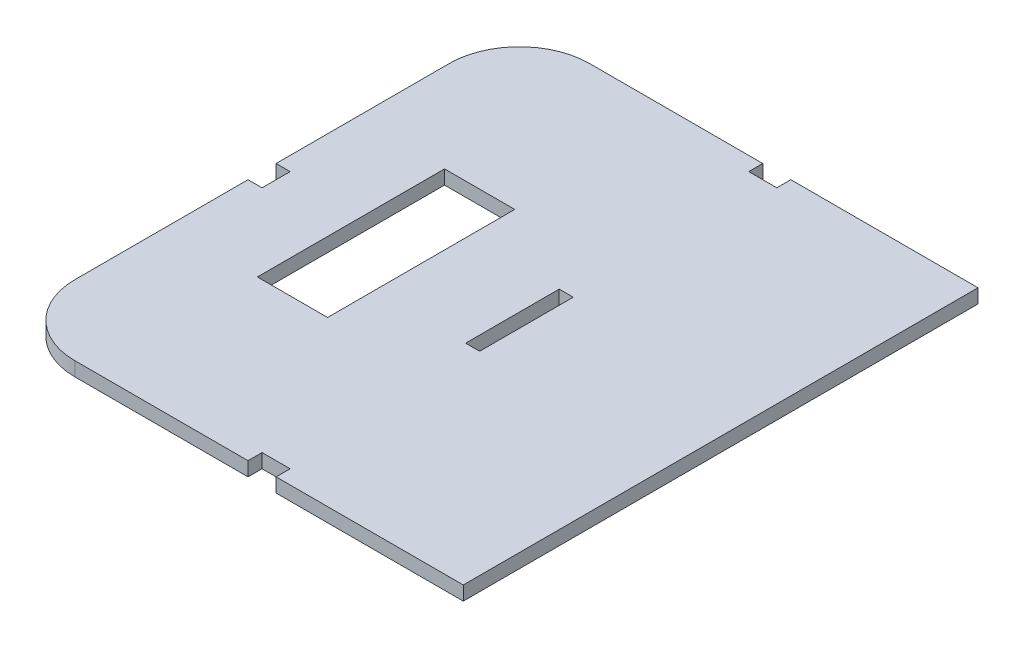
ISO-10303-21;
HEADER;
FILE_DESCRIPTION(('STEP AP214'),'2;1');
FILE_NAME('part.step','',(''),(''),'','','');
FILE_SCHEMA(('AUTOMOTIVE_DESIGN { 1 0 10303 214 1 1 1 1 }'));
ENDSEC;
DATA;
#1=APPLICATION_CONTEXT('core data for automotive mechanical design processes');
#2=APPLICATION_PROTOCOL_DEFINITION('international standard','automotive_design',2000,#1);
#3=PRODUCT_CONTEXT('',#1,'mechanical');
#4=PRODUCT('Part','Part','',(#3));
#5=PRODUCT_RELATED_PRODUCT_CATEGORY('part','',(#4));
#6=PRODUCT_DEFINITION_FORMATION('','',#4);
#7=PRODUCT_DEFINITION_CONTEXT('part definition',#1,'design');
#8=PRODUCT_DEFINITION('design','',#6,#7);
#9=PRODUCT_DEFINITION_SHAPE('','',#8);
#10=(LENGTH_UNIT() NAMED_UNIT(*) SI_UNIT(.MILLI.,.METRE.));
#11=(NAMED_UNIT(*) PLANE_ANGLE_UNIT() SI_UNIT($,.RADIAN.));
#12=(NAMED_UNIT(*) SI_UNIT($,.STERADIAN.) SOLID_ANGLE_UNIT());
#13=UNCERTAINTY_MEASURE_WITH_UNIT(LENGTH_MEASURE(1.E-05),#10,'distance_accuracy_value','');
#14=(GEOMETRIC_REPRESENTATION_CONTEXT(3) GLOBAL_UNCERTAINTY_ASSIGNED_CONTEXT((#13)) GLOBAL_UNIT_ASSIGNED_CONTEXT((#10,
#11,#12)) REPRESENTATION_CONTEXT('',''));
#15=CARTESIAN_POINT('',(0.,0.,0.));
#16=DIRECTION('',(0.,0.,1.));
#17=DIRECTION('',(1.,0.,0.));
#18=AXIS2_PLACEMENT_3D('',#15,#16,#17);
#19=CARTESIAN_POINT('',(0.,3.,-110.));
#20=DIRECTION('',(0.,0.,-1.));
#21=DIRECTION('',(-1.,0.,0.));
#22=AXIS2_PLACEMENT_3D('',#19,#20,#21);
#23=PLANE('',#22);
#24=DIRECTION('',(1.,0.,0.));
#25=VECTOR('',#24,1.);
#26=CARTESIAN_POINT('',(0.,0.,-110.));
#27=LINE('',#26,#25);
#28=CARTESIAN_POINT('',(58.,0.,-110.));
#29=VERTEX_POINT('',#28);
#30=CARTESIAN_POINT('',(98.,0.,-110.));
#31=VERTEX_POINT('',#30);
#32=EDGE_CURVE('E247',#29,#31,#27,.T.);
#33=ORIENTED_EDGE('',*,*,#32,.F.);
#34=DIRECTION('',(0.,-1.,0.));
#35=VECTOR('',#34,1.);
#36=CARTESIAN_POINT('',(58.,3.,-110.));
#37=LINE('',#36,#35);
#38=CARTESIAN_POINT('',(58.,3.,-110.));
#39=VERTEX_POINT('',#38);
#40=EDGE_CURVE('E385',#39,#29,#37,.T.);
#41=ORIENTED_EDGE('',*,*,#40,.F.);
#42=DIRECTION('',(1.,0.,0.));
#43=VECTOR('',#42,1.);
#44=CARTESIAN_POINT('',(0.,3.,-110.));
#45=LINE('',#44,#43);
#46=CARTESIAN_POINT('',(98.,3.,-110.));
#47=VERTEX_POINT('',#46);
#48=EDGE_CURVE('E270',#39,#47,#45,.T.);
#49=ORIENTED_EDGE('',*,*,#48,.T.);
#50=DIRECTION('',(0.,-1.,0.));
#51=VECTOR('',#50,1.);
#52=CARTESIAN_POINT('',(98.,3.,-110.));
#53=LINE('',#52,#51);
#54=EDGE_CURVE('E313',#47,#31,#53,.T.);
#55=ORIENTED_EDGE('',*,*,#54,.T.);
#56=EDGE_LOOP('',(#33,#41,#49,#55));
#57=FACE_BOUND('',#56,.T.);
#58=ADVANCED_FACE('F41',(#57),#23,.T.);
#59=CARTESIAN_POINT('',(58.,3.,0.));
#60=DIRECTION('',(-1.,0.,0.));
#61=DIRECTION('',(0.,0.,1.));
#62=AXIS2_PLACEMENT_3D('',#59,#60,#61);
#63=PLANE('',#62);
#64=DIRECTION('',(0.,0.,-1.));
#65=VECTOR('',#64,1.);
#66=CARTESIAN_POINT('',(58.,0.,0.));
#67=LINE('',#66,#65);
#68=CARTESIAN_POINT('',(58.,0.,-107.));
#69=VERTEX_POINT('',#68);
#70=EDGE_CURVE('E316',#69,#29,#67,.T.);
#71=ORIENTED_EDGE('',*,*,#70,.F.);
#72=DIRECTION('',(0.,-1.,0.));
#73=VECTOR('',#72,1.);
#74=CARTESIAN_POINT('',(58.,3.,-107.));
#75=LINE('',#74,#73);
#76=CARTESIAN_POINT('',(58.,3.,-107.));
#77=VERTEX_POINT('',#76);
#78=EDGE_CURVE('E383',#77,#69,#75,.T.);
#79=ORIENTED_EDGE('',*,*,#78,.F.);
#80=DIRECTION('',(0.,0.,-1.));
#81=VECTOR('',#80,1.);
#82=CARTESIAN_POINT('',(58.,3.,0.));
#83=LINE('',#82,#81);
#84=EDGE_CURVE('E273',#77,#39,#83,.T.);
#85=ORIENTED_EDGE('',*,*,#84,.T.);
#86=ORIENTED_EDGE('',*,*,#40,.T.);
#87=EDGE_LOOP('',(#71,#79,#85,#86));
#88=FACE_BOUND('',#87,.T.);
#89=ADVANCED_FACE('F482',(#88),#63,.T.);
#90=CARTESIAN_POINT('',(0.,3.,-107.));
#91=DIRECTION('',(0.,0.,-1.));
#92=DIRECTION('',(-1.,0.,0.));
#93=AXIS2_PLACEMENT_3D('',#90,#91,#92);
#94=PLANE('',#93);
#95=DIRECTION('',(1.,0.,0.));
#96=VECTOR('',#95,1.);
#97=CARTESIAN_POINT('',(0.,0.,-107.));
#98=LINE('',#97,#96);
#99=CARTESIAN_POINT('',(52.,0.,-107.));
#100=VERTEX_POINT('',#99);
#101=EDGE_CURVE('E319',#100,#69,#98,.T.);
#102=ORIENTED_EDGE('',*,*,#101,.F.);
#103=DIRECTION('',(0.,-1.,0.));
#104=VECTOR('',#103,1.);
#105=CARTESIAN_POINT('',(52.,3.,-107.));
#106=LINE('',#105,#104);
#107=CARTESIAN_POINT('',(52.,3.,-107.));
#108=VERTEX_POINT('',#107);
#109=EDGE_CURVE('E381',#108,#100,#106,.T.);
#110=ORIENTED_EDGE('',*,*,#109,.F.);
#111=DIRECTION('',(1.,0.,0.));
#112=VECTOR('',#111,1.);
#113=CARTESIAN_POINT('',(0.,3.,-107.));
#114=LINE('',#113,#112);
#115=EDGE_CURVE('E277',#108,#77,#114,.T.);
#116=ORIENTED_EDGE('',*,*,#115,.T.);
#117=ORIENTED_EDGE('',*,*,#78,.T.);
#118=EDGE_LOOP('',(#102,#110,#116,#117));
#119=FACE_BOUND('',#118,.T.);
#120=ADVANCED_FACE('F485',(#119),#94,.T.);
#121=CARTESIAN_POINT('',(52.,3.,0.));
#122=DIRECTION('',(-1.,0.,0.));
#123=DIRECTION('',(0.,0.,1.));
#124=AXIS2_PLACEMENT_3D('',#121,#122,#123);
#125=PLANE('',#124);
#126=DIRECTION('',(0.,0.,-1.));
#127=VECTOR('',#126,1.);
#128=CARTESIAN_POINT('',(52.,0.,0.));
#129=LINE('',#128,#127);
#130=CARTESIAN_POINT('',(52.,0.,-110.));
#131=VERTEX_POINT('',#130);
#132=EDGE_CURVE('E322',#100,#131,#129,.T.);
#133=ORIENTED_EDGE('',*,*,#132,.T.);
#134=DIRECTION('',(0.,-1.,0.));
#135=VECTOR('',#134,1.);
#136=CARTESIAN_POINT('',(52.,3.,-110.));
#137=LINE('',#136,#135);
#138=CARTESIAN_POINT('',(52.,3.,-110.));
#139=VERTEX_POINT('',#138);
#140=EDGE_CURVE('E378',#139,#131,#137,.T.);
#141=ORIENTED_EDGE('',*,*,#140,.F.);
#142=DIRECTION('',(0.,0.,-1.));
#143=VECTOR('',#142,1.);
#144=CARTESIAN_POINT('',(52.,3.,0.));
#145=LINE('',#144,#143);
#146=EDGE_CURVE('E280',#108,#139,#145,.T.);
#147=ORIENTED_EDGE('',*,*,#146,.F.);
#148=ORIENTED_EDGE('',*,*,#109,.T.);
#149=EDGE_LOOP('',(#133,#141,#147,#148));
#150=FACE_BOUND('',#149,.T.);
#151=ADVANCED_FACE('F489',(#150),#125,.F.);
#152=CARTESIAN_POINT('',(0.,3.,-110.));
#153=DIRECTION('',(0.,0.,-1.));
#154=DIRECTION('',(-1.,0.,0.));
#155=AXIS2_PLACEMENT_3D('',#152,#153,#154);
#156=PLANE('',#155);
#157=DIRECTION('',(1.,0.,0.));
#158=VECTOR('',#157,1.);
#159=CARTESIAN_POINT('',(0.,0.,-110.));
#160=LINE('',#159,#158);
#161=CARTESIAN_POINT('',(15.,0.,-110.));
#162=VERTEX_POINT('',#161);
#163=EDGE_CURVE('E325',#162,#131,#160,.T.);
#164=ORIENTED_EDGE('',*,*,#163,.F.);
#165=DIRECTION('',(0.,-1.,0.));
#166=VECTOR('',#165,1.);
#167=CARTESIAN_POINT('',(15.,3.,-110.));
#168=LINE('',#167,#166);
#169=CARTESIAN_POINT('',(15.,3.,-110.));
#170=VERTEX_POINT('',#169);
#171=EDGE_CURVE('E11',#162,#170,#168,.F.);
#172=ORIENTED_EDGE('',*,*,#171,.T.);
#173=DIRECTION('',(1.,0.,0.));
#174=VECTOR('',#173,1.);
#175=CARTESIAN_POINT('',(0.,3.,-110.));
#176=LINE('',#175,#174);
#177=EDGE_CURVE('E283',#170,#139,#176,.T.);
#178=ORIENTED_EDGE('',*,*,#177,.T.);
#179=ORIENTED_EDGE('',*,*,#140,.T.);
#180=EDGE_LOOP('',(#164,#172,#178,#179));
#181=FACE_BOUND('',#180,.T.);
#182=ADVANCED_FACE('F491',(#181),#156,.T.);
#183=CARTESIAN_POINT('',(0.,3.,0.));
#184=DIRECTION('',(-1.,0.,0.));
#185=DIRECTION('',(0.,0.,1.));
#186=AXIS2_PLACEMENT_3D('',#183,#184,#185);
#187=PLANE('',#186);
#188=DIRECTION('',(0.,0.,-1.));
#189=VECTOR('',#188,1.);
#190=CARTESIAN_POINT('',(0.,3.,0.));
#191=LINE('',#190,#189);
#192=CARTESIAN_POINT('',(0.,3.,-58.));
#193=VERTEX_POINT('',#192);
#194=CARTESIAN_POINT('',(0.,3.,-95.));
#195=VERTEX_POINT('',#194);
#196=EDGE_CURVE('E285',#193,#195,#191,.T.);
#197=ORIENTED_EDGE('',*,*,#196,.T.);
#198=DIRECTION('',(0.,-1.,0.));
#199=VECTOR('',#198,1.);
#200=CARTESIAN_POINT('',(0.,3.,-95.));
#201=LINE('',#200,#199);
#202=CARTESIAN_POINT('',(0.,0.,-95.));
#203=VERTEX_POINT('',#202);
#204=EDGE_CURVE('E49',#195,#203,#201,.T.);
#205=ORIENTED_EDGE('',*,*,#204,.T.);
#206=DIRECTION('',(0.,0.,-1.));
#207=VECTOR('',#206,1.);
#208=CARTESIAN_POINT('',(0.,0.,0.));
#209=LINE('',#208,#207);
#210=CARTESIAN_POINT('',(0.,0.,-58.));
#211=VERTEX_POINT('',#210);
#212=EDGE_CURVE('E327',#211,#203,#209,.T.);
#213=ORIENTED_EDGE('',*,*,#212,.F.);
#214=DIRECTION('',(0.,-1.,0.));
#215=VECTOR('',#214,1.);
#216=CARTESIAN_POINT('',(0.,3.,-58.));
#217=LINE('',#216,#215);
#218=EDGE_CURVE('E376',#193,#211,#217,.T.);
#219=ORIENTED_EDGE('',*,*,#218,.F.);
#220=EDGE_LOOP('',(#197,#205,#213,#219));
#221=FACE_BOUND('',#220,.T.);
#222=ADVANCED_FACE('F423',(#221),#187,.T.);
#223=CARTESIAN_POINT('',(0.,3.,-58.));
#224=DIRECTION('',(0.,0.,1.));
#225=DIRECTION('',(1.,0.,0.));
#226=AXIS2_PLACEMENT_3D('',#223,#224,#225);
#227=PLANE('',#226);
#228=DIRECTION('',(-1.,0.,0.));
#229=VECTOR('',#228,1.);
#230=CARTESIAN_POINT('',(0.,0.,-58.));
#231=LINE('',#230,#229);
#232=CARTESIAN_POINT('',(3.,0.,-58.));
#233=VERTEX_POINT('',#232);
#234=EDGE_CURVE('E330',#233,#211,#231,.T.);
#235=ORIENTED_EDGE('',*,*,#234,.F.);
#236=DIRECTION('',(0.,-1.,0.));
#237=VECTOR('',#236,1.);
#238=CARTESIAN_POINT('',(3.,3.,-58.));
#239=LINE('',#238,#237);
#240=CARTESIAN_POINT('',(3.,3.,-58.));
#241=VERTEX_POINT('',#240);
#242=EDGE_CURVE('E374',#241,#233,#239,.T.);
#243=ORIENTED_EDGE('',*,*,#242,.F.);
#244=DIRECTION('',(-1.,0.,0.));
#245=VECTOR('',#244,1.);
#246=CARTESIAN_POINT('',(0.,3.,-58.));
#247=LINE('',#246,#245);
#248=EDGE_CURVE('E287',#241,#193,#247,.T.);
#249=ORIENTED_EDGE('',*,*,#248,.T.);
#250=ORIENTED_EDGE('',*,*,#218,.T.);
#251=EDGE_LOOP('',(#235,#243,#249,#250));
#252=FACE_BOUND('',#251,.T.);
#253=ADVANCED_FACE('F432',(#252),#227,.T.);
#254=CARTESIAN_POINT('',(3.,3.,0.));
#255=DIRECTION('',(-1.,0.,0.));
#256=DIRECTION('',(0.,0.,1.));
#257=AXIS2_PLACEMENT_3D('',#254,#255,#256);
#258=PLANE('',#257);
#259=DIRECTION('',(0.,0.,-1.));
#260=VECTOR('',#259,1.);
#261=CARTESIAN_POINT('',(3.,0.,0.));
#262=LINE('',#261,#260);
#263=CARTESIAN_POINT('',(3.,0.,-52.));
#264=VERTEX_POINT('',#263);
#265=EDGE_CURVE('E333',#264,#233,#262,.T.);
#266=ORIENTED_EDGE('',*,*,#265,.F.);
#267=DIRECTION('',(0.,-1.,0.));
#268=VECTOR('',#267,1.);
#269=CARTESIAN_POINT('',(3.,3.,-52.));
#270=LINE('',#269,#268);
#271=CARTESIAN_POINT('',(3.,3.,-52.));
#272=VERTEX_POINT('',#271);
#273=EDGE_CURVE('E372',#272,#264,#270,.T.);
#274=ORIENTED_EDGE('',*,*,#273,.F.);
#275=DIRECTION('',(0.,0.,-1.));
#276=VECTOR('',#275,1.);
#277=CARTESIAN_POINT('',(3.,3.,0.));
#278=LINE('',#277,#276);
#279=EDGE_CURVE('E290',#272,#241,#278,.T.);
#280=ORIENTED_EDGE('',*,*,#279,.T.);
#281=ORIENTED_EDGE('',*,*,#242,.T.);
#282=EDGE_LOOP('',(#266,#274,#280,#281));
#283=FACE_BOUND('',#282,.T.);
#284=ADVANCED_FACE('F437',(#283),#258,.T.);
#285=CARTESIAN_POINT('',(0.,3.,-52.));
#286=DIRECTION('',(0.,0.,1.));
#287=DIRECTION('',(1.,0.,0.));
#288=AXIS2_PLACEMENT_3D('',#285,#286,#287);
#289=PLANE('',#288);
#290=DIRECTION('',(-1.,0.,0.));
#291=VECTOR('',#290,1.);
#292=CARTESIAN_POINT('',(0.,0.,-52.));
#293=LINE('',#292,#291);
#294=CARTESIAN_POINT('',(0.,0.,-52.));
#295=VERTEX_POINT('',#294);
#296=EDGE_CURVE('E336',#264,#295,#293,.T.);
#297=ORIENTED_EDGE('',*,*,#296,.T.);
#298=DIRECTION('',(0.,-1.,0.));
#299=VECTOR('',#298,1.);
#300=CARTESIAN_POINT('',(0.,3.,-52.));
#301=LINE('',#300,#299);
#302=CARTESIAN_POINT('',(0.,3.,-52.));
#303=VERTEX_POINT('',#302);
#304=EDGE_CURVE('E369',#303,#295,#301,.T.);
#305=ORIENTED_EDGE('',*,*,#304,.F.);
#306=DIRECTION('',(-1.,0.,0.));
#307=VECTOR('',#306,1.);
#308=CARTESIAN_POINT('',(0.,3.,-52.));
#309=LINE('',#308,#307);
#310=EDGE_CURVE('E293',#272,#303,#309,.T.);
#311=ORIENTED_EDGE('',*,*,#310,.F.);
#312=ORIENTED_EDGE('',*,*,#273,.T.);
#313=EDGE_LOOP('',(#297,#305,#311,#312));
#314=FACE_BOUND('',#313,.T.);
#315=ADVANCED_FACE('F441',(#314),#289,.F.);
#316=CARTESIAN_POINT('',(0.,3.,0.));
#317=DIRECTION('',(-1.,0.,0.));
#318=DIRECTION('',(0.,0.,1.));
#319=AXIS2_PLACEMENT_3D('',#316,#317,#318);
#320=PLANE('',#319);
#321=DIRECTION('',(0.,0.,-1.));
#322=VECTOR('',#321,1.);
#323=CARTESIAN_POINT('',(0.,0.,0.));
#324=LINE('',#323,#322);
#325=CARTESIAN_POINT('',(0.,0.,-15.));
#326=VERTEX_POINT('',#325);
#327=EDGE_CURVE('E339',#326,#295,#324,.T.);
#328=ORIENTED_EDGE('',*,*,#327,.F.);
#329=DIRECTION('',(0.,-1.,0.));
#330=VECTOR('',#329,1.);
#331=CARTESIAN_POINT('',(0.,3.,-15.));
#332=LINE('',#331,#330);
#333=CARTESIAN_POINT('',(0.,3.,-15.));
#334=VERTEX_POINT('',#333);
#335=EDGE_CURVE('E415',#326,#334,#332,.F.);
#336=ORIENTED_EDGE('',*,*,#335,.T.);
#337=DIRECTION('',(0.,0.,-1.));
#338=VECTOR('',#337,1.);
#339=CARTESIAN_POINT('',(0.,3.,0.));
#340=LINE('',#339,#338);
#341=EDGE_CURVE('E296',#334,#303,#340,.T.);
#342=ORIENTED_EDGE('',*,*,#341,.T.);
#343=ORIENTED_EDGE('',*,*,#304,.T.);
#344=EDGE_LOOP('',(#328,#336,#342,#343));
#345=FACE_BOUND('',#344,.T.);
#346=ADVANCED_FACE('F517',(#345),#320,.T.);
#347=CARTESIAN_POINT('',(0.,3.,0.));
#348=DIRECTION('',(0.,0.,-1.));
#349=DIRECTION('',(-1.,0.,0.));
#350=AXIS2_PLACEMENT_3D('',#347,#348,#349);
#351=PLANE('',#350);
#352=DIRECTION('',(1.,0.,0.));
#353=VECTOR('',#352,1.);
#354=CARTESIAN_POINT('',(0.,3.,0.));
#355=LINE('',#354,#353);
#356=CARTESIAN_POINT('',(15.,3.,0.));
#357=VERTEX_POINT('',#356);
#358=CARTESIAN_POINT('',(52.,3.,0.));
#359=VERTEX_POINT('',#358);
#360=EDGE_CURVE('E298',#357,#359,#355,.T.);
#361=ORIENTED_EDGE('',*,*,#360,.F.);
#362=DIRECTION('',(0.,-1.,0.));
#363=VECTOR('',#362,1.);
#364=CARTESIAN_POINT('',(15.,0.,0.));
#365=LINE('',#364,#363);
#366=CARTESIAN_POINT('',(15.,0.,0.));
#367=VERTEX_POINT('',#366);
#368=EDGE_CURVE('E408',#357,#367,#365,.T.);
#369=ORIENTED_EDGE('',*,*,#368,.T.);
#370=DIRECTION('',(1.,0.,0.));
#371=VECTOR('',#370,1.);
#372=CARTESIAN_POINT('',(0.,0.,0.));
#373=LINE('',#372,#371);
#374=CARTESIAN_POINT('',(52.,0.,0.));
#375=VERTEX_POINT('',#374);
#376=EDGE_CURVE('E341',#367,#375,#373,.T.);
#377=ORIENTED_EDGE('',*,*,#376,.T.);
#378=DIRECTION('',(0.,-1.,0.));
#379=VECTOR('',#378,1.);
#380=CARTESIAN_POINT('',(52.,3.,0.));
#381=LINE('',#380,#379);
#382=EDGE_CURVE('E366',#359,#375,#381,.T.);
#383=ORIENTED_EDGE('',*,*,#382,.F.);
#384=EDGE_LOOP('',(#361,#369,#377,#383));
#385=FACE_BOUND('',#384,.T.);
#386=ADVANCED_FACE('F450',(#385),#351,.F.);
#387=CARTESIAN_POINT('',(52.,3.,0.));
#388=DIRECTION('',(1.,0.,0.));
#389=DIRECTION('',(0.,0.,-1.));
#390=AXIS2_PLACEMENT_3D('',#387,#388,#389);
#391=PLANE('',#390);
#392=DIRECTION('',(0.,0.,1.));
#393=VECTOR('',#392,1.);
#394=CARTESIAN_POINT('',(52.,0.,0.));
#395=LINE('',#394,#393);
#396=CARTESIAN_POINT('',(52.,0.,-3.));
#397=VERTEX_POINT('',#396);
#398=EDGE_CURVE('E343',#397,#375,#395,.T.);
#399=ORIENTED_EDGE('',*,*,#398,.F.);
#400=DIRECTION('',(0.,-1.,0.));
#401=VECTOR('',#400,1.);
#402=CARTESIAN_POINT('',(52.,3.,-3.));
#403=LINE('',#402,#401);
#404=CARTESIAN_POINT('',(52.,3.,-3.));
#405=VERTEX_POINT('',#404);
#406=EDGE_CURVE('E364',#405,#397,#403,.T.);
#407=ORIENTED_EDGE('',*,*,#406,.F.);
#408=DIRECTION('',(0.,0.,1.));
#409=VECTOR('',#408,1.);
#410=CARTESIAN_POINT('',(52.,3.,0.));
#411=LINE('',#410,#409);
#412=EDGE_CURVE('E300',#405,#359,#411,.T.);
#413=ORIENTED_EDGE('',*,*,#412,.T.);
#414=ORIENTED_EDGE('',*,*,#382,.T.);
#415=EDGE_LOOP('',(#399,#407,#413,#414));
#416=FACE_BOUND('',#415,.T.);
#417=ADVANCED_FACE('F457',(#416),#391,.T.);
#418=CARTESIAN_POINT('',(0.,3.,-3.));
#419=DIRECTION('',(0.,0.,1.));
#420=DIRECTION('',(1.,0.,0.));
#421=AXIS2_PLACEMENT_3D('',#418,#419,#420);
#422=PLANE('',#421);
#423=DIRECTION('',(-1.,0.,0.));
#424=VECTOR('',#423,1.);
#425=CARTESIAN_POINT('',(0.,0.,-3.));
#426=LINE('',#425,#424);
#427=CARTESIAN_POINT('',(58.,0.,-3.));
#428=VERTEX_POINT('',#427);
#429=EDGE_CURVE('E346',#428,#397,#426,.T.);
#430=ORIENTED_EDGE('',*,*,#429,.F.);
#431=DIRECTION('',(0.,-1.,0.));
#432=VECTOR('',#431,1.);
#433=CARTESIAN_POINT('',(58.,3.,-3.));
#434=LINE('',#433,#432);
#435=CARTESIAN_POINT('',(58.,3.,-3.));
#436=VERTEX_POINT('',#435);
#437=EDGE_CURVE('E362',#436,#428,#434,.T.);
#438=ORIENTED_EDGE('',*,*,#437,.F.);
#439=DIRECTION('',(-1.,0.,0.));
#440=VECTOR('',#439,1.);
#441=CARTESIAN_POINT('',(0.,3.,-3.));
#442=LINE('',#441,#440);
#443=EDGE_CURVE('E303',#436,#405,#442,.T.);
#444=ORIENTED_EDGE('',*,*,#443,.T.);
#445=ORIENTED_EDGE('',*,*,#406,.T.);
#446=EDGE_LOOP('',(#430,#438,#444,#445));
#447=FACE_BOUND('',#446,.T.);
#448=ADVANCED_FACE('F461',(#447),#422,.T.);
#449=CARTESIAN_POINT('',(58.,3.,0.));
#450=DIRECTION('',(1.,0.,0.));
#451=DIRECTION('',(0.,0.,-1.));
#452=AXIS2_PLACEMENT_3D('',#449,#450,#451);
#453=PLANE('',#452);
#454=DIRECTION('',(0.,0.,1.));
#455=VECTOR('',#454,1.);
#456=CARTESIAN_POINT('',(58.,0.,0.));
#457=LINE('',#456,#455);
#458=CARTESIAN_POINT('',(58.,0.,0.));
#459=VERTEX_POINT('',#458);
#460=EDGE_CURVE('E349',#428,#459,#457,.T.);
#461=ORIENTED_EDGE('',*,*,#460,.T.);
#462=DIRECTION('',(0.,-1.,0.));
#463=VECTOR('',#462,1.);
#464=CARTESIAN_POINT('',(58.,3.,0.));
#465=LINE('',#464,#463);
#466=CARTESIAN_POINT('',(58.,3.,0.));
#467=VERTEX_POINT('',#466);
#468=EDGE_CURVE('E359',#467,#459,#465,.T.);
#469=ORIENTED_EDGE('',*,*,#468,.F.);
#470=DIRECTION('',(0.,0.,1.));
#471=VECTOR('',#470,1.);
#472=CARTESIAN_POINT('',(58.,3.,0.));
#473=LINE('',#472,#471);
#474=EDGE_CURVE('E306',#436,#467,#473,.T.);
#475=ORIENTED_EDGE('',*,*,#474,.F.);
#476=ORIENTED_EDGE('',*,*,#437,.T.);
#477=EDGE_LOOP('',(#461,#469,#475,#476));
#478=FACE_BOUND('',#477,.T.);
#479=ADVANCED_FACE('F465',(#478),#453,.F.);
#480=CARTESIAN_POINT('',(0.,3.,0.));
#481=DIRECTION('',(0.,0.,-1.));
#482=DIRECTION('',(-1.,0.,0.));
#483=AXIS2_PLACEMENT_3D('',#480,#481,#482);
#484=PLANE('',#483);
#485=DIRECTION('',(1.,0.,0.));
#486=VECTOR('',#485,1.);
#487=CARTESIAN_POINT('',(0.,0.,0.));
#488=LINE('',#487,#486);
#489=CARTESIAN_POINT('',(98.,0.,0.));
#490=VERTEX_POINT('',#489);
#491=EDGE_CURVE('E351',#459,#490,#488,.T.);
#492=ORIENTED_EDGE('',*,*,#491,.T.);
#493=DIRECTION('',(0.,-1.,0.));
#494=VECTOR('',#493,1.);
#495=CARTESIAN_POINT('',(98.,3.,0.));
#496=LINE('',#495,#494);
#497=CARTESIAN_POINT('',(98.,3.,0.));
#498=VERTEX_POINT('',#497);
#499=EDGE_CURVE('E357',#498,#490,#496,.T.);
#500=ORIENTED_EDGE('',*,*,#499,.F.);
#501=DIRECTION('',(1.,0.,0.));
#502=VECTOR('',#501,1.);
#503=CARTESIAN_POINT('',(0.,3.,0.));
#504=LINE('',#503,#502);
#505=EDGE_CURVE('E308',#467,#498,#504,.T.);
#506=ORIENTED_EDGE('',*,*,#505,.F.);
#507=ORIENTED_EDGE('',*,*,#468,.T.);
#508=EDGE_LOOP('',(#492,#500,#506,#507));
#509=FACE_BOUND('',#508,.T.);
#510=ADVANCED_FACE('F471',(#509),#484,.F.);
#511=CARTESIAN_POINT('',(98.,3.,0.));
#512=DIRECTION('',(1.,0.,0.));
#513=DIRECTION('',(0.,0.,-1.));
#514=AXIS2_PLACEMENT_3D('',#511,#512,#513);
#515=PLANE('',#514);
#516=DIRECTION('',(0.,0.,1.));
#517=VECTOR('',#516,1.);
#518=CARTESIAN_POINT('',(98.,0.,0.));
#519=LINE('',#518,#517);
#520=EDGE_CURVE('E274',#31,#490,#519,.T.);
#521=ORIENTED_EDGE('',*,*,#520,.F.);
#522=ORIENTED_EDGE('',*,*,#54,.F.);
#523=DIRECTION('',(0.,0.,1.));
#524=VECTOR('',#523,1.);
#525=CARTESIAN_POINT('',(98.,3.,0.));
#526=LINE('',#525,#524);
#527=EDGE_CURVE('E310',#47,#498,#526,.T.);
#528=ORIENTED_EDGE('',*,*,#527,.T.);
#529=ORIENTED_EDGE('',*,*,#499,.T.);
#530=EDGE_LOOP('',(#521,#522,#528,#529));
#531=FACE_BOUND('',#530,.T.);
#532=ADVANCED_FACE('F475',(#531),#515,.T.);
#533=CARTESIAN_POINT('',(0.,3.,0.));
#534=DIRECTION('',(0.,1.,0.));
#535=DIRECTION('',(0.,0.,1.));
#536=AXIS2_PLACEMENT_3D('',#533,#534,#535);
#537=PLANE('',#536);
#538=DIRECTION('',(0.,0.,1.));
#539=VECTOR('',#538,1.);
#540=CARTESIAN_POINT('',(19.,3.,-75.));
#541=LINE('',#540,#539);
#542=CARTESIAN_POINT('',(19.,3.,-75.));
#543=VERTEX_POINT('',#542);
#544=CARTESIAN_POINT('',(19.,3.,-35.));
#545=VERTEX_POINT('',#544);
#546=EDGE_CURVE('E235',#543,#545,#541,.T.);
#547=ORIENTED_EDGE('',*,*,#546,.F.);
#548=DIRECTION('',(-1.,0.,0.));
#549=VECTOR('',#548,1.);
#550=CARTESIAN_POINT('',(19.,3.,-75.));
#551=LINE('',#550,#549);
#552=CARTESIAN_POINT('',(34.,3.,-75.0000000000001));
#553=VERTEX_POINT('',#552);
#554=EDGE_CURVE('E240',#553,#543,#551,.T.);
#555=ORIENTED_EDGE('',*,*,#554,.F.);
#556=DIRECTION('',(0.,0.,-1.));
#557=VECTOR('',#556,1.);
#558=CARTESIAN_POINT('',(34.,3.,-75.0000000000001));
#559=LINE('',#558,#557);
#560=CARTESIAN_POINT('',(34.,3.,-35.));
#561=VERTEX_POINT('',#560);
#562=EDGE_CURVE('E219',#561,#553,#559,.T.);
#563=ORIENTED_EDGE('',*,*,#562,.F.);
#564=DIRECTION('',(1.,0.,0.));
#565=VECTOR('',#564,1.);
#566=CARTESIAN_POINT('',(19.,3.,-35.));
#567=LINE('',#566,#565);
#568=EDGE_CURVE('E230',#545,#561,#567,.T.);
#569=ORIENTED_EDGE('',*,*,#568,.F.);
#570=EDGE_LOOP('',(#547,#555,#563,#569));
#571=FACE_BOUND('',#570,.T.);
#572=DIRECTION('',(0.,0.,1.));
#573=VECTOR('',#572,1.);
#574=CARTESIAN_POINT('',(53.5,3.,-65.));
#575=LINE('',#574,#573);
#576=CARTESIAN_POINT('',(53.5,3.,-65.));
#577=VERTEX_POINT('',#576);
#578=CARTESIAN_POINT('',(53.5,3.,-45.));
#579=VERTEX_POINT('',#578);
#580=EDGE_CURVE('E268',#577,#579,#575,.T.);
#581=ORIENTED_EDGE('',*,*,#580,.F.);
#582=DIRECTION('',(-1.,0.,0.));
#583=VECTOR('',#582,1.);
#584=CARTESIAN_POINT('',(53.5,3.,-65.));
#585=LINE('',#584,#583);
#586=CARTESIAN_POINT('',(56.5,3.,-65.));
#587=VERTEX_POINT('',#586);
#588=EDGE_CURVE('E253',#587,#577,#585,.T.);
#589=ORIENTED_EDGE('',*,*,#588,.F.);
#590=DIRECTION('',(0.,0.,-1.));
#591=VECTOR('',#590,1.);
#592=CARTESIAN_POINT('',(56.5,3.,-65.));
#593=LINE('',#592,#591);
#594=CARTESIAN_POINT('',(56.5,3.,-45.));
#595=VERTEX_POINT('',#594);
#596=EDGE_CURVE('E262',#595,#587,#593,.T.);
#597=ORIENTED_EDGE('',*,*,#596,.F.);
#598=DIRECTION('',(1.,0.,0.));
#599=VECTOR('',#598,1.);
#600=CARTESIAN_POINT('',(53.5,3.,-45.));
#601=LINE('',#600,#599);
#602=EDGE_CURVE('E265',#579,#595,#601,.T.);
#603=ORIENTED_EDGE('',*,*,#602,.F.);
#604=EDGE_LOOP('',(#581,#589,#597,#603));
#605=FACE_BOUND('',#604,.T.);
#606=ORIENTED_EDGE('',*,*,#341,.F.);
#607=CARTESIAN_POINT('',(15.,3.,-15.));
#608=DIRECTION('',(0.,1.,0.));
#609=DIRECTION('',(0.,0.,1.));
#610=AXIS2_PLACEMENT_3D('',#607,#608,#609);
#611=CIRCLE('',#610,15.);
#612=EDGE_CURVE('E418',#334,#357,#611,.T.);
#613=ORIENTED_EDGE('',*,*,#612,.T.);
#614=ORIENTED_EDGE('',*,*,#360,.T.);
#615=ORIENTED_EDGE('',*,*,#412,.F.);
#616=ORIENTED_EDGE('',*,*,#443,.F.);
#617=ORIENTED_EDGE('',*,*,#474,.T.);
#618=ORIENTED_EDGE('',*,*,#505,.T.);
#619=ORIENTED_EDGE('',*,*,#527,.F.);
#620=ORIENTED_EDGE('',*,*,#48,.F.);
#621=ORIENTED_EDGE('',*,*,#84,.F.);
#622=ORIENTED_EDGE('',*,*,#115,.F.);
#623=ORIENTED_EDGE('',*,*,#146,.T.);
#624=ORIENTED_EDGE('',*,*,#177,.F.);
#625=CARTESIAN_POINT('',(15.,3.,-95.));
#626=DIRECTION('',(0.,1.,0.));
#627=DIRECTION('',(0.,0.,1.));
#628=AXIS2_PLACEMENT_3D('',#625,#626,#627);
#629=CIRCLE('',#628,15.);
#630=EDGE_CURVE('E56',#170,#195,#629,.T.);
#631=ORIENTED_EDGE('',*,*,#630,.T.);
#632=ORIENTED_EDGE('',*,*,#196,.F.);
#633=ORIENTED_EDGE('',*,*,#248,.F.);
#634=ORIENTED_EDGE('',*,*,#279,.F.);
#635=ORIENTED_EDGE('',*,*,#310,.T.);
#636=EDGE_LOOP('',(#606,#613,#614,#615,#616,#617,#618,#619,#620,#621,#622,#623,#624,#631,#632,
#633,#634,#635));
#637=FACE_BOUND('',#636,.T.);
#638=ADVANCED_FACE('F237',(#571,#605,#637),#537,.T.);
#639=CARTESIAN_POINT('',(0.,0.,0.));
#640=DIRECTION('',(0.,1.,0.));
#641=DIRECTION('',(0.,0.,1.));
#642=AXIS2_PLACEMENT_3D('',#639,#640,#641);
#643=PLANE('',#642);
#644=DIRECTION('',(-1.,0.,0.));
#645=VECTOR('',#644,1.);
#646=CARTESIAN_POINT('',(0.,0.,-75.));
#647=LINE('',#646,#645);
#648=CARTESIAN_POINT('',(34.,0.,-75.0000000000001));
#649=VERTEX_POINT('',#648);
#650=CARTESIAN_POINT('',(19.,0.,-75.));
#651=VERTEX_POINT('',#650);
#652=EDGE_CURVE('E402',#649,#651,#647,.T.);
#653=ORIENTED_EDGE('',*,*,#652,.T.);
#654=DIRECTION('',(0.,0.,1.));
#655=VECTOR('',#654,1.);
#656=CARTESIAN_POINT('',(19.,0.,0.));
#657=LINE('',#656,#655);
#658=CARTESIAN_POINT('',(19.,0.,-35.));
#659=VERTEX_POINT('',#658);
#660=EDGE_CURVE('E405',#651,#659,#657,.T.);
#661=ORIENTED_EDGE('',*,*,#660,.T.);
#662=DIRECTION('',(1.,0.,0.));
#663=VECTOR('',#662,1.);
#664=CARTESIAN_POINT('',(0.,0.,-35.));
#665=LINE('',#664,#663);
#666=CARTESIAN_POINT('',(34.,0.,-35.));
#667=VERTEX_POINT('',#666);
#668=EDGE_CURVE('E399',#659,#667,#665,.T.);
#669=ORIENTED_EDGE('',*,*,#668,.T.);
#670=DIRECTION('',(0.,0.,-1.));
#671=VECTOR('',#670,1.);
#672=CARTESIAN_POINT('',(34.,0.,0.));
#673=LINE('',#672,#671);
#674=EDGE_CURVE('E222',#667,#649,#673,.T.);
#675=ORIENTED_EDGE('',*,*,#674,.T.);
#676=EDGE_LOOP('',(#653,#661,#669,#675));
#677=FACE_BOUND('',#676,.T.);
#678=DIRECTION('',(-1.,0.,0.));
#679=VECTOR('',#678,1.);
#680=CARTESIAN_POINT('',(0.,0.,-65.));
#681=LINE('',#680,#679);
#682=CARTESIAN_POINT('',(56.5,0.,-65.));
#683=VERTEX_POINT('',#682);
#684=CARTESIAN_POINT('',(53.5,0.,-65.));
#685=VERTEX_POINT('',#684);
#686=EDGE_CURVE('E393',#683,#685,#681,.T.);
#687=ORIENTED_EDGE('',*,*,#686,.T.);
#688=DIRECTION('',(0.,0.,1.));
#689=VECTOR('',#688,1.);
#690=CARTESIAN_POINT('',(53.5,0.,0.));
#691=LINE('',#690,#689);
#692=CARTESIAN_POINT('',(53.5,0.,-45.));
#693=VERTEX_POINT('',#692);
#694=EDGE_CURVE('E396',#685,#693,#691,.T.);
#695=ORIENTED_EDGE('',*,*,#694,.T.);
#696=DIRECTION('',(1.,0.,0.));
#697=VECTOR('',#696,1.);
#698=CARTESIAN_POINT('',(0.,0.,-45.));
#699=LINE('',#698,#697);
#700=CARTESIAN_POINT('',(56.5,0.,-45.));
#701=VERTEX_POINT('',#700);
#702=EDGE_CURVE('E387',#693,#701,#699,.T.);
#703=ORIENTED_EDGE('',*,*,#702,.T.);
#704=DIRECTION('',(0.,0.,-1.));
#705=VECTOR('',#704,1.);
#706=CARTESIAN_POINT('',(56.5,0.,0.));
#707=LINE('',#706,#705);
#708=EDGE_CURVE('E390',#701,#683,#707,.T.);
#709=ORIENTED_EDGE('',*,*,#708,.T.);
#710=EDGE_LOOP('',(#687,#695,#703,#709));
#711=FACE_BOUND('',#710,.T.);
#712=ORIENTED_EDGE('',*,*,#376,.F.);
#713=CARTESIAN_POINT('',(15.,0.,-15.));
#714=DIRECTION('',(0.,1.,0.));
#715=DIRECTION('',(0.,0.,1.));
#716=AXIS2_PLACEMENT_3D('',#713,#714,#715);
#717=CIRCLE('',#716,15.);
#718=EDGE_CURVE('E413',#367,#326,#717,.F.);
#719=ORIENTED_EDGE('',*,*,#718,.T.);
#720=ORIENTED_EDGE('',*,*,#327,.T.);
#721=ORIENTED_EDGE('',*,*,#296,.F.);
#722=ORIENTED_EDGE('',*,*,#265,.T.);
#723=ORIENTED_EDGE('',*,*,#234,.T.);
#724=ORIENTED_EDGE('',*,*,#212,.T.);
#725=CARTESIAN_POINT('',(15.,0.,-95.));
#726=DIRECTION('',(0.,1.,0.));
#727=DIRECTION('',(0.,0.,1.));
#728=AXIS2_PLACEMENT_3D('',#725,#726,#727);
#729=CIRCLE('',#728,15.);
#730=EDGE_CURVE('E411',#203,#162,#729,.F.);
#731=ORIENTED_EDGE('',*,*,#730,.T.);
#732=ORIENTED_EDGE('',*,*,#163,.T.);
#733=ORIENTED_EDGE('',*,*,#132,.F.);
#734=ORIENTED_EDGE('',*,*,#101,.T.);
#735=ORIENTED_EDGE('',*,*,#70,.T.);
#736=ORIENTED_EDGE('',*,*,#32,.T.);
#737=ORIENTED_EDGE('',*,*,#520,.T.);
#738=ORIENTED_EDGE('',*,*,#491,.F.);
#739=ORIENTED_EDGE('',*,*,#460,.F.);
#740=ORIENTED_EDGE('',*,*,#429,.T.);
#741=ORIENTED_EDGE('',*,*,#398,.T.);
#742=EDGE_LOOP('',(#712,#719,#720,#721,#722,#723,#724,#731,#732,#733,#734,#735,#736,#737,#738,
#739,#740,#741));
#743=FACE_BOUND('',#742,.T.);
#744=ADVANCED_FACE('F427',(#677,#711,#743),#643,.F.);
#745=CARTESIAN_POINT('',(53.5,-7.,-65.));
#746=DIRECTION('',(-1.,0.,0.));
#747=DIRECTION('',(0.,0.,1.));
#748=AXIS2_PLACEMENT_3D('',#745,#746,#747);
#749=PLANE('',#748);
#750=DIRECTION('',(0.,1.,0.));
#751=VECTOR('',#750,1.);
#752=CARTESIAN_POINT('',(53.5,-7.,-65.));
#753=LINE('',#752,#751);
#754=EDGE_CURVE('E258',#685,#577,#753,.T.);
#755=ORIENTED_EDGE('',*,*,#754,.T.);
#756=ORIENTED_EDGE('',*,*,#580,.T.);
#757=DIRECTION('',(0.,1.,0.));
#758=VECTOR('',#757,1.);
#759=CARTESIAN_POINT('',(53.5,-7.,-45.));
#760=LINE('',#759,#758);
#761=EDGE_CURVE('E250',#693,#579,#760,.T.);
#762=ORIENTED_EDGE('',*,*,#761,.F.);
#763=ORIENTED_EDGE('',*,*,#694,.F.);
#764=EDGE_LOOP('',(#755,#756,#762,#763));
#765=FACE_BOUND('',#764,.T.);
#766=ADVANCED_FACE('F534',(#765),#749,.F.);
#767=CARTESIAN_POINT('',(53.5,-7.,-65.));
#768=DIRECTION('',(0.,0.,-1.));
#769=DIRECTION('',(-1.,0.,0.));
#770=AXIS2_PLACEMENT_3D('',#767,#768,#769);
#771=PLANE('',#770);
#772=DIRECTION('',(0.,1.,0.));
#773=VECTOR('',#772,1.);
#774=CARTESIAN_POINT('',(56.5,-7.,-65.));
#775=LINE('',#774,#773);
#776=EDGE_CURVE('E256',#683,#587,#775,.T.);
#777=ORIENTED_EDGE('',*,*,#776,.T.);
#778=ORIENTED_EDGE('',*,*,#588,.T.);
#779=ORIENTED_EDGE('',*,*,#754,.F.);
#780=ORIENTED_EDGE('',*,*,#686,.F.);
#781=EDGE_LOOP('',(#777,#778,#779,#780));
#782=FACE_BOUND('',#781,.T.);
#783=ADVANCED_FACE('F538',(#782),#771,.F.);
#784=CARTESIAN_POINT('',(56.5,-7.,-65.));
#785=DIRECTION('',(1.,0.,0.));
#786=DIRECTION('',(0.,0.,-1.));
#787=AXIS2_PLACEMENT_3D('',#784,#785,#786);
#788=PLANE('',#787);
#789=DIRECTION('',(0.,1.,0.));
#790=VECTOR('',#789,1.);
#791=CARTESIAN_POINT('',(56.5,-7.,-45.));
#792=LINE('',#791,#790);
#793=EDGE_CURVE('E254',#701,#595,#792,.T.);
#794=ORIENTED_EDGE('',*,*,#793,.T.);
#795=ORIENTED_EDGE('',*,*,#596,.T.);
#796=ORIENTED_EDGE('',*,*,#776,.F.);
#797=ORIENTED_EDGE('',*,*,#708,.F.);
#798=EDGE_LOOP('',(#794,#795,#796,#797));
#799=FACE_BOUND('',#798,.T.);
#800=ADVANCED_FACE('F541',(#799),#788,.F.);
#801=CARTESIAN_POINT('',(53.5,-7.,-45.));
#802=DIRECTION('',(0.,0.,1.));
#803=DIRECTION('',(1.,0.,0.));
#804=AXIS2_PLACEMENT_3D('',#801,#802,#803);
#805=PLANE('',#804);
#806=ORIENTED_EDGE('',*,*,#761,.T.);
#807=ORIENTED_EDGE('',*,*,#602,.T.);
#808=ORIENTED_EDGE('',*,*,#793,.F.);
#809=ORIENTED_EDGE('',*,*,#702,.F.);
#810=EDGE_LOOP('',(#806,#807,#808,#809));
#811=FACE_BOUND('',#810,.T.);
#812=ADVANCED_FACE('F545',(#811),#805,.F.);
#813=CARTESIAN_POINT('',(19.,-7.,-75.));
#814=DIRECTION('',(-1.,0.,0.));
#815=DIRECTION('',(0.,0.,1.));
#816=AXIS2_PLACEMENT_3D('',#813,#814,#815);
#817=PLANE('',#816);
#818=DIRECTION('',(0.,1.,0.));
#819=VECTOR('',#818,1.);
#820=CARTESIAN_POINT('',(19.,-7.,-75.));
#821=LINE('',#820,#819);
#822=EDGE_CURVE('E245',#651,#543,#821,.T.);
#823=ORIENTED_EDGE('',*,*,#822,.T.);
#824=ORIENTED_EDGE('',*,*,#546,.T.);
#825=DIRECTION('',(0.,1.,0.));
#826=VECTOR('',#825,1.);
#827=CARTESIAN_POINT('',(19.,-7.,-35.));
#828=LINE('',#827,#826);
#829=EDGE_CURVE('E226',#659,#545,#828,.T.);
#830=ORIENTED_EDGE('',*,*,#829,.F.);
#831=ORIENTED_EDGE('',*,*,#660,.F.);
#832=EDGE_LOOP('',(#823,#824,#830,#831));
#833=FACE_BOUND('',#832,.T.);
#834=ADVANCED_FACE('F549',(#833),#817,.F.);
#835=CARTESIAN_POINT('',(19.,-7.,-75.));
#836=DIRECTION('',(0.,0.,-1.));
#837=DIRECTION('',(-1.,0.,0.));
#838=AXIS2_PLACEMENT_3D('',#835,#836,#837);
#839=PLANE('',#838);
#840=DIRECTION('',(0.,1.,0.));
#841=VECTOR('',#840,1.);
#842=CARTESIAN_POINT('',(34.,-7.,-75.0000000000001));
#843=LINE('',#842,#841);
#844=EDGE_CURVE('E225',#649,#553,#843,.T.);
#845=ORIENTED_EDGE('',*,*,#844,.T.);
#846=ORIENTED_EDGE('',*,*,#554,.T.);
#847=ORIENTED_EDGE('',*,*,#822,.F.);
#848=ORIENTED_EDGE('',*,*,#652,.F.);
#849=EDGE_LOOP('',(#845,#846,#847,#848));
#850=FACE_BOUND('',#849,.T.);
#851=ADVANCED_FACE('F556',(#850),#839,.F.);
#852=CARTESIAN_POINT('',(34.,-7.,-75.0000000000001));
#853=DIRECTION('',(1.,0.,0.));
#854=DIRECTION('',(0.,0.,-1.));
#855=AXIS2_PLACEMENT_3D('',#852,#853,#854);
#856=PLANE('',#855);
#857=DIRECTION('',(0.,1.,0.));
#858=VECTOR('',#857,1.);
#859=CARTESIAN_POINT('',(34.,-7.,-35.));
#860=LINE('',#859,#858);
#861=EDGE_CURVE('E214',#667,#561,#860,.T.);
#862=ORIENTED_EDGE('',*,*,#861,.T.);
#863=ORIENTED_EDGE('',*,*,#562,.T.);
#864=ORIENTED_EDGE('',*,*,#844,.F.);
#865=ORIENTED_EDGE('',*,*,#674,.F.);
#866=EDGE_LOOP('',(#862,#863,#864,#865));
#867=FACE_BOUND('',#866,.T.);
#868=ADVANCED_FACE('F216',(#867),#856,.F.);
#869=CARTESIAN_POINT('',(19.,-7.,-35.));
#870=DIRECTION('',(0.,0.,1.));
#871=DIRECTION('',(1.,0.,0.));
#872=AXIS2_PLACEMENT_3D('',#869,#870,#871);
#873=PLANE('',#872);
#874=ORIENTED_EDGE('',*,*,#829,.T.);
#875=ORIENTED_EDGE('',*,*,#568,.T.);
#876=ORIENTED_EDGE('',*,*,#861,.F.);
#877=ORIENTED_EDGE('',*,*,#668,.F.);
#878=EDGE_LOOP('',(#874,#875,#876,#877));
#879=FACE_BOUND('',#878,.T.);
#880=ADVANCED_FACE('F231',(#879),#873,.F.);
#881=CARTESIAN_POINT('',(15.,3.,-15.));
#882=DIRECTION('',(0.,1.,0.));
#883=DIRECTION('',(0.,0.,1.));
#884=AXIS2_PLACEMENT_3D('',#881,#882,#883);
#885=CYLINDRICAL_SURFACE('',#884,15.);
#886=ORIENTED_EDGE('',*,*,#612,.F.);
#887=ORIENTED_EDGE('',*,*,#335,.F.);
#888=ORIENTED_EDGE('',*,*,#718,.F.);
#889=ORIENTED_EDGE('',*,*,#368,.F.);
#890=EDGE_LOOP('',(#886,#887,#888,#889));
#891=FACE_BOUND('',#890,.T.);
#892=ADVANCED_FACE('F448',(#891),#885,.T.);
#893=CARTESIAN_POINT('',(15.,3.,-95.));
#894=DIRECTION('',(0.,-1.,0.));
#895=DIRECTION('',(0.,0.,-1.));
#896=AXIS2_PLACEMENT_3D('',#893,#894,#895);
#897=CYLINDRICAL_SURFACE('',#896,15.);
#898=ORIENTED_EDGE('',*,*,#630,.F.);
#899=ORIENTED_EDGE('',*,*,#171,.F.);
#900=ORIENTED_EDGE('',*,*,#730,.F.);
#901=ORIENTED_EDGE('',*,*,#204,.F.);
#902=EDGE_LOOP('',(#898,#899,#900,#901));
#903=FACE_BOUND('',#902,.T.);
#904=ADVANCED_FACE('F43',(#903),#897,.T.);
#905=CLOSED_SHELL('',(#58,#89,#120,#151,#182,#222,#253,#284,#315,#346,#386,#417,#448,#479,#510,
#532,#638,#744,#766,#783,#800,#812,#834,#851,#868,#880,#892,#904));
#906=MANIFOLD_SOLID_BREP('B2',#905);
#907=ADVANCED_BREP_SHAPE_REPRESENTATION('',(#18,#906),#14);
#908=SHAPE_DEFINITION_REPRESENTATION(#9,#907);
ENDSEC;
END-ISO-10303-21;
